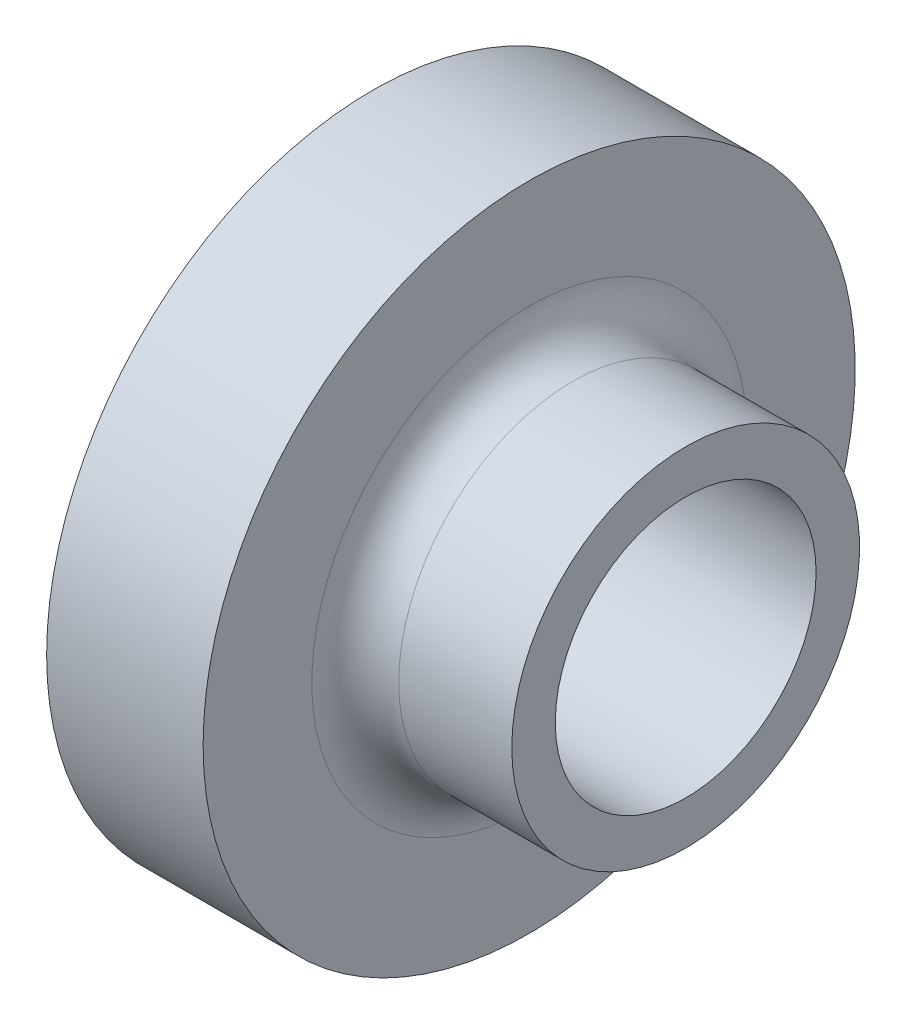
ISO-10303-21;
HEADER;
FILE_DESCRIPTION(('STEP AP214'),'2;1');
FILE_NAME('part.step','',(''),(''),'','','');
FILE_SCHEMA(('AUTOMOTIVE_DESIGN { 1 0 10303 214 1 1 1 1 }'));
ENDSEC;
DATA;
#1=APPLICATION_CONTEXT('core data for automotive mechanical design processes');
#2=APPLICATION_PROTOCOL_DEFINITION('international standard','automotive_design',2000,#1);
#3=PRODUCT_CONTEXT('',#1,'mechanical');
#4=PRODUCT('Part','Part','',(#3));
#5=PRODUCT_RELATED_PRODUCT_CATEGORY('part','',(#4));
#6=PRODUCT_DEFINITION_FORMATION('','',#4);
#7=PRODUCT_DEFINITION_CONTEXT('part definition',#1,'design');
#8=PRODUCT_DEFINITION('design','',#6,#7);
#9=PRODUCT_DEFINITION_SHAPE('','',#8);
#10=(LENGTH_UNIT() NAMED_UNIT(*) SI_UNIT(.MILLI.,.METRE.));
#11=(NAMED_UNIT(*) PLANE_ANGLE_UNIT() SI_UNIT($,.RADIAN.));
#12=(NAMED_UNIT(*) SI_UNIT($,.STERADIAN.) SOLID_ANGLE_UNIT());
#13=UNCERTAINTY_MEASURE_WITH_UNIT(LENGTH_MEASURE(1.E-05),#10,'distance_accuracy_value','');
#14=(GEOMETRIC_REPRESENTATION_CONTEXT(3) GLOBAL_UNCERTAINTY_ASSIGNED_CONTEXT((#13)) GLOBAL_UNIT_ASSIGNED_CONTEXT((#10,
#11,#12)) REPRESENTATION_CONTEXT('',''));
#15=CARTESIAN_POINT('',(0.,0.,0.));
#16=DIRECTION('',(0.,0.,1.));
#17=DIRECTION('',(1.,0.,0.));
#18=AXIS2_PLACEMENT_3D('',#15,#16,#17);
#19=CARTESIAN_POINT('',(0.,0.,0.));
#20=DIRECTION('',(-1.,0.,0.));
#21=DIRECTION('',(0.,0.,1.));
#22=AXIS2_PLACEMENT_3D('',#19,#20,#21);
#23=CYLINDRICAL_SURFACE('',#22,15.);
#24=CARTESIAN_POINT('',(0.,0.,0.));
#25=DIRECTION('',(-1.,0.,0.));
#26=DIRECTION('',(0.,0.,1.));
#27=AXIS2_PLACEMENT_3D('',#24,#25,#26);
#28=CIRCLE('',#27,15.);
#29=CARTESIAN_POINT('',(0.,0.,15.));
#30=VERTEX_POINT('',#29);
#31=EDGE_CURVE('E64',#30,#30,#28,.T.);
#32=ORIENTED_EDGE('',*,*,#31,.T.);
#33=EDGE_LOOP('',(#32));
#34=FACE_BOUND('',#33,.T.);
#35=CARTESIAN_POINT('',(36.,0.,0.));
#36=DIRECTION('',(-1.,0.,0.));
#37=DIRECTION('',(0.,0.,1.));
#38=AXIS2_PLACEMENT_3D('',#35,#36,#37);
#39=CIRCLE('',#38,15.);
#40=CARTESIAN_POINT('',(36.,0.,15.));
#41=VERTEX_POINT('',#40);
#42=EDGE_CURVE('E49',#41,#41,#39,.T.);
#43=ORIENTED_EDGE('',*,*,#42,.F.);
#44=EDGE_LOOP('',(#43));
#45=FACE_BOUND('',#44,.T.);
#46=ADVANCED_FACE('F38',(#34,#45),#23,.F.);
#47=CARTESIAN_POINT('',(36.,0.,0.));
#48=DIRECTION('',(1.,0.,0.));
#49=DIRECTION('',(0.,0.,-1.));
#50=AXIS2_PLACEMENT_3D('',#47,#48,#49);
#51=PLANE('',#50);
#52=ORIENTED_EDGE('',*,*,#42,.T.);
#53=EDGE_LOOP('',(#52));
#54=FACE_BOUND('',#53,.T.);
#55=CARTESIAN_POINT('',(36.,0.,0.));
#56=DIRECTION('',(-1.,0.,0.));
#57=DIRECTION('',(0.,0.,1.));
#58=AXIS2_PLACEMENT_3D('',#55,#56,#57);
#59=CIRCLE('',#58,20.);
#60=CARTESIAN_POINT('',(36.,0.,20.));
#61=VERTEX_POINT('',#60);
#62=EDGE_CURVE('E53',#61,#61,#59,.T.);
#63=ORIENTED_EDGE('',*,*,#62,.F.);
#64=EDGE_LOOP('',(#63));
#65=FACE_BOUND('',#64,.T.);
#66=ADVANCED_FACE('F84',(#54,#65),#51,.T.);
#67=CARTESIAN_POINT('',(0.,0.,0.));
#68=DIRECTION('',(-1.,0.,0.));
#69=DIRECTION('',(0.,0.,1.));
#70=AXIS2_PLACEMENT_3D('',#67,#68,#69);
#71=CYLINDRICAL_SURFACE('',#70,20.);
#72=CARTESIAN_POINT('',(23.,0.,0.));
#73=DIRECTION('',(1.,0.,0.));
#74=DIRECTION('',(0.,0.,-1.));
#75=AXIS2_PLACEMENT_3D('',#72,#73,#74);
#76=CIRCLE('',#75,20.);
#77=CARTESIAN_POINT('',(23.,0.,-20.));
#78=VERTEX_POINT('',#77);
#79=EDGE_CURVE('E10',#78,#78,#76,.T.);
#80=ORIENTED_EDGE('',*,*,#79,.T.);
#81=EDGE_LOOP('',(#80));
#82=FACE_BOUND('',#81,.T.);
#83=ORIENTED_EDGE('',*,*,#62,.T.);
#84=EDGE_LOOP('',(#83));
#85=FACE_BOUND('',#84,.T.);
#86=ADVANCED_FACE('F88',(#82,#85),#71,.T.);
#87=CARTESIAN_POINT('',(18.,0.,0.));
#88=DIRECTION('',(1.,0.,0.));
#89=DIRECTION('',(0.,0.,-1.));
#90=AXIS2_PLACEMENT_3D('',#87,#88,#89);
#91=PLANE('',#90);
#92=CARTESIAN_POINT('',(18.,0.,0.));
#93=DIRECTION('',(1.,0.,0.));
#94=DIRECTION('',(0.,0.,-1.));
#95=AXIS2_PLACEMENT_3D('',#92,#93,#94);
#96=CIRCLE('',#95,25.);
#97=CARTESIAN_POINT('',(18.,0.,-25.));
#98=VERTEX_POINT('',#97);
#99=EDGE_CURVE('E45',#98,#98,#96,.F.);
#100=ORIENTED_EDGE('',*,*,#99,.T.);
#101=EDGE_LOOP('',(#100));
#102=FACE_BOUND('',#101,.T.);
#103=CARTESIAN_POINT('',(18.,0.,0.));
#104=DIRECTION('',(-1.,0.,0.));
#105=DIRECTION('',(0.,0.,1.));
#106=AXIS2_PLACEMENT_3D('',#103,#104,#105);
#107=CIRCLE('',#106,37.5);
#108=CARTESIAN_POINT('',(18.,0.,37.5));
#109=VERTEX_POINT('',#108);
#110=EDGE_CURVE('E58',#109,#109,#107,.T.);
#111=ORIENTED_EDGE('',*,*,#110,.F.);
#112=EDGE_LOOP('',(#111));
#113=FACE_BOUND('',#112,.T.);
#114=ADVANCED_FACE('F80',(#102,#113),#91,.T.);
#115=CARTESIAN_POINT('',(0.,0.,0.));
#116=DIRECTION('',(-1.,0.,0.));
#117=DIRECTION('',(0.,0.,1.));
#118=AXIS2_PLACEMENT_3D('',#115,#116,#117);
#119=CYLINDRICAL_SURFACE('',#118,37.5);
#120=ORIENTED_EDGE('',*,*,#110,.T.);
#121=EDGE_LOOP('',(#120));
#122=FACE_BOUND('',#121,.T.);
#123=CARTESIAN_POINT('',(0.,0.,0.));
#124=DIRECTION('',(-1.,0.,0.));
#125=DIRECTION('',(0.,0.,1.));
#126=AXIS2_PLACEMENT_3D('',#123,#124,#125);
#127=CIRCLE('',#126,37.5);
#128=CARTESIAN_POINT('',(0.,0.,37.5));
#129=VERTEX_POINT('',#128);
#130=EDGE_CURVE('E61',#129,#129,#127,.T.);
#131=ORIENTED_EDGE('',*,*,#130,.F.);
#132=EDGE_LOOP('',(#131));
#133=FACE_BOUND('',#132,.T.);
#134=ADVANCED_FACE('F72',(#122,#133),#119,.T.);
#135=CARTESIAN_POINT('',(0.,0.,0.));
#136=DIRECTION('',(-1.,0.,0.));
#137=DIRECTION('',(0.,0.,1.));
#138=AXIS2_PLACEMENT_3D('',#135,#136,#137);
#139=PLANE('',#138);
#140=ORIENTED_EDGE('',*,*,#130,.T.);
#141=EDGE_LOOP('',(#140));
#142=FACE_BOUND('',#141,.T.);
#143=ORIENTED_EDGE('',*,*,#31,.F.);
#144=EDGE_LOOP('',(#143));
#145=FACE_BOUND('',#144,.T.);
#146=ADVANCED_FACE('F70',(#142,#145),#139,.T.);
#147=CARTESIAN_POINT('',(23.,0.,0.));
#148=DIRECTION('',(1.,0.,0.));
#149=DIRECTION('',(0.,0.,-1.));
#150=AXIS2_PLACEMENT_3D('',#147,#148,#149);
#151=TOROIDAL_SURFACE('',#150,25.,5.);
#152=ORIENTED_EDGE('',*,*,#79,.F.);
#153=EDGE_LOOP('',(#152));
#154=FACE_BOUND('',#153,.T.);
#155=ORIENTED_EDGE('',*,*,#99,.F.);
#156=EDGE_LOOP('',(#155));
#157=FACE_BOUND('',#156,.T.);
#158=ADVANCED_FACE('F40',(#154,#157),#151,.F.);
#159=CLOSED_SHELL('',(#46,#66,#86,#114,#134,#146,#158));
#160=MANIFOLD_SOLID_BREP('B2',#159);
#161=ADVANCED_BREP_SHAPE_REPRESENTATION('',(#18,#160),#14);
#162=SHAPE_DEFINITION_REPRESENTATION(#9,#161);
ENDSEC;
END-ISO-10303-21;
